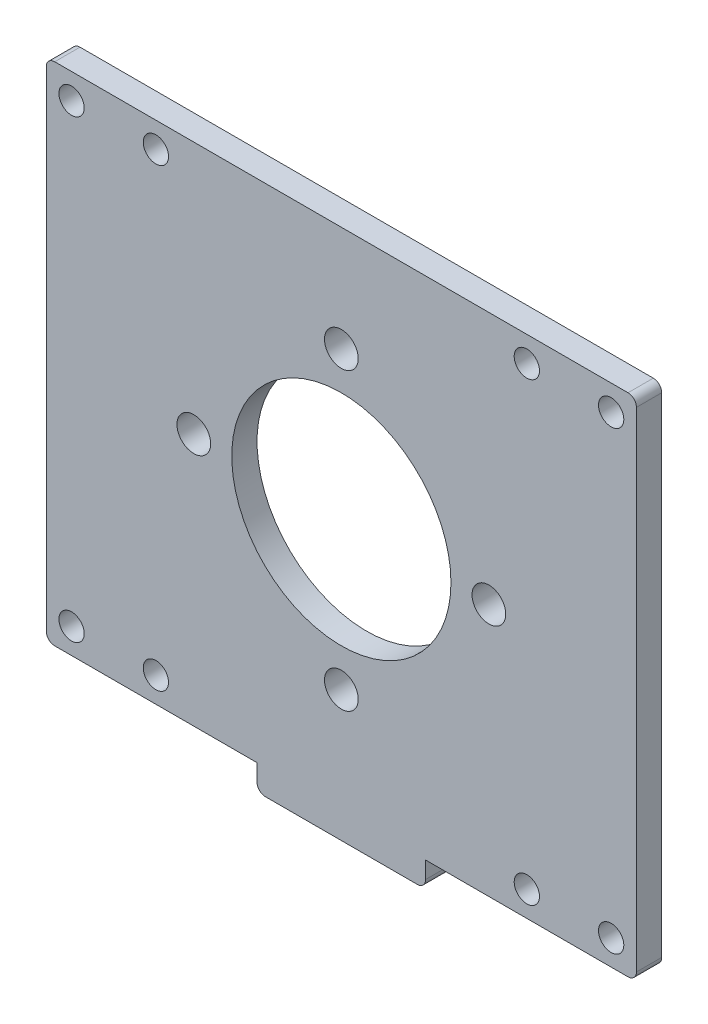
ISO-10303-21;
HEADER;
FILE_DESCRIPTION(('STEP AP214'),'2;1');
FILE_NAME('part.step','',(''),(''),'','','');
FILE_SCHEMA(('AUTOMOTIVE_DESIGN { 1 0 10303 214 1 1 1 1 }'));
ENDSEC;
DATA;
#1=APPLICATION_CONTEXT('core data for automotive mechanical design processes');
#2=APPLICATION_PROTOCOL_DEFINITION('international standard','automotive_design',2000,#1);
#3=PRODUCT_CONTEXT('',#1,'mechanical');
#4=PRODUCT('Part','Part','',(#3));
#5=PRODUCT_RELATED_PRODUCT_CATEGORY('part','',(#4));
#6=PRODUCT_DEFINITION_FORMATION('','',#4);
#7=PRODUCT_DEFINITION_CONTEXT('part definition',#1,'design');
#8=PRODUCT_DEFINITION('design','',#6,#7);
#9=PRODUCT_DEFINITION_SHAPE('','',#8);
#10=(LENGTH_UNIT() NAMED_UNIT(*) SI_UNIT(.MILLI.,.METRE.));
#11=(NAMED_UNIT(*) PLANE_ANGLE_UNIT() SI_UNIT($,.RADIAN.));
#12=(NAMED_UNIT(*) SI_UNIT($,.STERADIAN.) SOLID_ANGLE_UNIT());
#13=UNCERTAINTY_MEASURE_WITH_UNIT(LENGTH_MEASURE(1.E-05),#10,'distance_accuracy_value','');
#14=(GEOMETRIC_REPRESENTATION_CONTEXT(3) GLOBAL_UNCERTAINTY_ASSIGNED_CONTEXT((#13)) GLOBAL_UNIT_ASSIGNED_CONTEXT((#10,
#11,#12)) REPRESENTATION_CONTEXT('',''));
#15=CARTESIAN_POINT('',(0.,0.,0.));
#16=DIRECTION('',(0.,0.,1.));
#17=DIRECTION('',(1.,0.,0.));
#18=AXIS2_PLACEMENT_3D('',#15,#16,#17);
#19=CARTESIAN_POINT('',(-35.,-30.,3.));
#20=DIRECTION('',(0.,1.,0.));
#21=DIRECTION('',(0.,0.,1.));
#22=AXIS2_PLACEMENT_3D('',#19,#20,#21);
#23=PLANE('',#22);
#24=DIRECTION('',(1.,0.,0.));
#25=VECTOR('',#24,1.);
#26=CARTESIAN_POINT('',(-35.,-30.,0.));
#27=LINE('',#26,#25);
#28=CARTESIAN_POINT('',(10.,-30.,0.));
#29=VERTEX_POINT('',#28);
#30=CARTESIAN_POINT('',(34.,-30.,0.));
#31=VERTEX_POINT('',#30);
#32=EDGE_CURVE('E156',#29,#31,#27,.T.);
#33=ORIENTED_EDGE('',*,*,#32,.T.);
#34=DIRECTION('',(0.,0.,-1.));
#35=VECTOR('',#34,1.);
#36=CARTESIAN_POINT('',(34.,-30.,3.));
#37=LINE('',#36,#35);
#38=CARTESIAN_POINT('',(34.,-30.,3.));
#39=VERTEX_POINT('',#38);
#40=EDGE_CURVE('E61',#31,#39,#37,.F.);
#41=ORIENTED_EDGE('',*,*,#40,.T.);
#42=DIRECTION('',(1.,0.,0.));
#43=VECTOR('',#42,1.);
#44=CARTESIAN_POINT('',(-35.,-30.,3.));
#45=LINE('',#44,#43);
#46=CARTESIAN_POINT('',(10.,-30.,3.));
#47=VERTEX_POINT('',#46);
#48=EDGE_CURVE('E163',#47,#39,#45,.T.);
#49=ORIENTED_EDGE('',*,*,#48,.F.);
#50=DIRECTION('',(0.,0.,1.));
#51=VECTOR('',#50,1.);
#52=CARTESIAN_POINT('',(10.,-30.,0.));
#53=LINE('',#52,#51);
#54=EDGE_CURVE('E155',#29,#47,#53,.T.);
#55=ORIENTED_EDGE('',*,*,#54,.F.);
#56=EDGE_LOOP('',(#33,#41,#49,#55));
#57=FACE_BOUND('',#56,.T.);
#58=ADVANCED_FACE('F44',(#57),#23,.F.);
#59=CARTESIAN_POINT('',(35.,-30.,3.));
#60=DIRECTION('',(-1.,0.,0.));
#61=DIRECTION('',(0.,0.,1.));
#62=AXIS2_PLACEMENT_3D('',#59,#60,#61);
#63=PLANE('',#62);
#64=DIRECTION('',(0.,1.,0.));
#65=VECTOR('',#64,1.);
#66=CARTESIAN_POINT('',(35.,-30.,0.));
#67=LINE('',#66,#65);
#68=CARTESIAN_POINT('',(35.,-29.,0.));
#69=VERTEX_POINT('',#68);
#70=CARTESIAN_POINT('',(35.,29.,0.));
#71=VERTEX_POINT('',#70);
#72=EDGE_CURVE('E266',#69,#71,#67,.T.);
#73=ORIENTED_EDGE('',*,*,#72,.T.);
#74=DIRECTION('',(0.,0.,-1.));
#75=VECTOR('',#74,1.);
#76=CARTESIAN_POINT('',(35.,29.,3.));
#77=LINE('',#76,#75);
#78=CARTESIAN_POINT('',(35.,29.,3.));
#79=VERTEX_POINT('',#78);
#80=EDGE_CURVE('E238',#71,#79,#77,.F.);
#81=ORIENTED_EDGE('',*,*,#80,.T.);
#82=DIRECTION('',(0.,1.,0.));
#83=VECTOR('',#82,1.);
#84=CARTESIAN_POINT('',(35.,-30.,3.));
#85=LINE('',#84,#83);
#86=CARTESIAN_POINT('',(35.,-29.,3.));
#87=VERTEX_POINT('',#86);
#88=EDGE_CURVE('E174',#87,#79,#85,.T.);
#89=ORIENTED_EDGE('',*,*,#88,.F.);
#90=DIRECTION('',(0.,0.,-1.));
#91=VECTOR('',#90,1.);
#92=CARTESIAN_POINT('',(35.,-29.,3.));
#93=LINE('',#92,#91);
#94=EDGE_CURVE('E234',#87,#69,#93,.T.);
#95=ORIENTED_EDGE('',*,*,#94,.T.);
#96=EDGE_LOOP('',(#73,#81,#89,#95));
#97=FACE_BOUND('',#96,.T.);
#98=ADVANCED_FACE('F370',(#97),#63,.F.);
#99=CARTESIAN_POINT('',(-35.,30.,3.));
#100=DIRECTION('',(0.,-1.,0.));
#101=DIRECTION('',(0.,0.,-1.));
#102=AXIS2_PLACEMENT_3D('',#99,#100,#101);
#103=PLANE('',#102);
#104=DIRECTION('',(-1.,0.,0.));
#105=VECTOR('',#104,1.);
#106=CARTESIAN_POINT('',(-35.,30.,0.));
#107=LINE('',#106,#105);
#108=CARTESIAN_POINT('',(34.,30.,0.));
#109=VERTEX_POINT('',#108);
#110=CARTESIAN_POINT('',(-34.,30.,0.));
#111=VERTEX_POINT('',#110);
#112=EDGE_CURVE('E180',#109,#111,#107,.T.);
#113=ORIENTED_EDGE('',*,*,#112,.T.);
#114=DIRECTION('',(0.,0.,-1.));
#115=VECTOR('',#114,1.);
#116=CARTESIAN_POINT('',(-34.,30.,3.));
#117=LINE('',#116,#115);
#118=CARTESIAN_POINT('',(-34.,30.,3.));
#119=VERTEX_POINT('',#118);
#120=EDGE_CURVE('E233',#111,#119,#117,.F.);
#121=ORIENTED_EDGE('',*,*,#120,.T.);
#122=DIRECTION('',(-1.,0.,0.));
#123=VECTOR('',#122,1.);
#124=CARTESIAN_POINT('',(-35.,30.,3.));
#125=LINE('',#124,#123);
#126=CARTESIAN_POINT('',(34.,30.,3.));
#127=VERTEX_POINT('',#126);
#128=EDGE_CURVE('E260',#127,#119,#125,.T.);
#129=ORIENTED_EDGE('',*,*,#128,.F.);
#130=DIRECTION('',(0.,0.,-1.));
#131=VECTOR('',#130,1.);
#132=CARTESIAN_POINT('',(34.,30.,3.));
#133=LINE('',#132,#131);
#134=EDGE_CURVE('E227',#127,#109,#133,.T.);
#135=ORIENTED_EDGE('',*,*,#134,.T.);
#136=EDGE_LOOP('',(#113,#121,#129,#135));
#137=FACE_BOUND('',#136,.T.);
#138=ADVANCED_FACE('F278',(#137),#103,.F.);
#139=CARTESIAN_POINT('',(-35.,-30.,3.));
#140=DIRECTION('',(1.,0.,0.));
#141=DIRECTION('',(0.,0.,-1.));
#142=AXIS2_PLACEMENT_3D('',#139,#140,#141);
#143=PLANE('',#142);
#144=DIRECTION('',(0.,-1.,0.));
#145=VECTOR('',#144,1.);
#146=CARTESIAN_POINT('',(-35.,-30.,0.));
#147=LINE('',#146,#145);
#148=CARTESIAN_POINT('',(-35.,29.,0.));
#149=VERTEX_POINT('',#148);
#150=CARTESIAN_POINT('',(-35.,-29.,0.));
#151=VERTEX_POINT('',#150);
#152=EDGE_CURVE('E171',#149,#151,#147,.T.);
#153=ORIENTED_EDGE('',*,*,#152,.T.);
#154=DIRECTION('',(0.,0.,-1.));
#155=VECTOR('',#154,1.);
#156=CARTESIAN_POINT('',(-35.,-29.,3.));
#157=LINE('',#156,#155);
#158=CARTESIAN_POINT('',(-35.,-29.,3.));
#159=VERTEX_POINT('',#158);
#160=EDGE_CURVE('E210',#151,#159,#157,.F.);
#161=ORIENTED_EDGE('',*,*,#160,.T.);
#162=DIRECTION('',(0.,-1.,0.));
#163=VECTOR('',#162,1.);
#164=CARTESIAN_POINT('',(-35.,-30.,3.));
#165=LINE('',#164,#163);
#166=CARTESIAN_POINT('',(-35.,29.,3.));
#167=VERTEX_POINT('',#166);
#168=EDGE_CURVE('E251',#167,#159,#165,.T.);
#169=ORIENTED_EDGE('',*,*,#168,.F.);
#170=DIRECTION('',(0.,0.,-1.));
#171=VECTOR('',#170,1.);
#172=CARTESIAN_POINT('',(-35.,29.,3.));
#173=LINE('',#172,#171);
#174=EDGE_CURVE('E203',#167,#149,#173,.T.);
#175=ORIENTED_EDGE('',*,*,#174,.T.);
#176=EDGE_LOOP('',(#153,#161,#169,#175));
#177=FACE_BOUND('',#176,.T.);
#178=ADVANCED_FACE('F286',(#177),#143,.F.);
#179=CARTESIAN_POINT('',(-34.,-30.,3.));
#180=VERTEX_POINT('',#179);
#181=CARTESIAN_POINT('',(-10.,-30.,3.));
#182=VERTEX_POINT('',#181);
#183=EDGE_CURVE('E187',#180,#182,#45,.T.);
#184=ORIENTED_EDGE('',*,*,#183,.F.);
#185=DIRECTION('',(0.,0.,-1.));
#186=VECTOR('',#185,1.);
#187=CARTESIAN_POINT('',(-34.,-30.,3.));
#188=LINE('',#187,#186);
#189=CARTESIAN_POINT('',(-34.,-30.,0.));
#190=VERTEX_POINT('',#189);
#191=EDGE_CURVE('E181',#180,#190,#188,.T.);
#192=ORIENTED_EDGE('',*,*,#191,.T.);
#193=CARTESIAN_POINT('',(-10.,-30.,0.));
#194=VERTEX_POINT('',#193);
#195=EDGE_CURVE('E167',#190,#194,#27,.T.);
#196=ORIENTED_EDGE('',*,*,#195,.T.);
#197=DIRECTION('',(0.,0.,1.));
#198=VECTOR('',#197,1.);
#199=CARTESIAN_POINT('',(-10.,-30.,0.));
#200=LINE('',#199,#198);
#201=EDGE_CURVE('E161',#194,#182,#200,.T.);
#202=ORIENTED_EDGE('',*,*,#201,.T.);
#203=EDGE_LOOP('',(#184,#192,#196,#202));
#204=FACE_BOUND('',#203,.T.);
#205=ADVANCED_FACE('F301',(#204),#23,.F.);
#206=CARTESIAN_POINT('',(0.,0.,3.));
#207=DIRECTION('',(0.,0.,-1.));
#208=DIRECTION('',(-1.,0.,0.));
#209=AXIS2_PLACEMENT_3D('',#206,#207,#208);
#210=PLANE('',#209);
#211=CARTESIAN_POINT('',(-32.,-27.,3.));
#212=DIRECTION('',(0.,0.,1.));
#213=DIRECTION('',(1.,0.,0.));
#214=AXIS2_PLACEMENT_3D('',#211,#212,#213);
#215=CIRCLE('',#214,1.5);
#216=CARTESIAN_POINT('',(-30.5,-27.,3.));
#217=VERTEX_POINT('',#216);
#218=EDGE_CURVE('E660',#217,#217,#215,.T.);
#219=ORIENTED_EDGE('',*,*,#218,.F.);
#220=EDGE_LOOP('',(#219));
#221=FACE_BOUND('',#220,.T.);
#222=CARTESIAN_POINT('',(-22.,-27.,3.));
#223=DIRECTION('',(0.,0.,1.));
#224=DIRECTION('',(1.,0.,0.));
#225=AXIS2_PLACEMENT_3D('',#222,#223,#224);
#226=CIRCLE('',#225,1.5);
#227=CARTESIAN_POINT('',(-20.5,-27.,3.));
#228=VERTEX_POINT('',#227);
#229=EDGE_CURVE('E659',#228,#228,#226,.T.);
#230=ORIENTED_EDGE('',*,*,#229,.F.);
#231=EDGE_LOOP('',(#230));
#232=FACE_BOUND('',#231,.T.);
#233=CARTESIAN_POINT('',(22.,-27.,3.));
#234=DIRECTION('',(0.,0.,1.));
#235=DIRECTION('',(-1.,0.,0.));
#236=AXIS2_PLACEMENT_3D('',#233,#234,#235);
#237=CIRCLE('',#236,1.5);
#238=CARTESIAN_POINT('',(20.5,-27.,3.));
#239=VERTEX_POINT('',#238);
#240=EDGE_CURVE('E675',#239,#239,#237,.T.);
#241=ORIENTED_EDGE('',*,*,#240,.F.);
#242=EDGE_LOOP('',(#241));
#243=FACE_BOUND('',#242,.T.);
#244=CARTESIAN_POINT('',(32.,-27.,3.));
#245=DIRECTION('',(0.,0.,1.));
#246=DIRECTION('',(-1.,0.,0.));
#247=AXIS2_PLACEMENT_3D('',#244,#245,#246);
#248=CIRCLE('',#247,1.5);
#249=CARTESIAN_POINT('',(30.5,-27.,3.));
#250=VERTEX_POINT('',#249);
#251=EDGE_CURVE('E676',#250,#250,#248,.T.);
#252=ORIENTED_EDGE('',*,*,#251,.F.);
#253=EDGE_LOOP('',(#252));
#254=FACE_BOUND('',#253,.T.);
#255=CARTESIAN_POINT('',(-32.,27.,3.));
#256=DIRECTION('',(0.,0.,1.));
#257=DIRECTION('',(1.,0.,0.));
#258=AXIS2_PLACEMENT_3D('',#255,#256,#257);
#259=CIRCLE('',#258,1.5);
#260=CARTESIAN_POINT('',(-30.5,27.,3.));
#261=VERTEX_POINT('',#260);
#262=EDGE_CURVE('E691',#261,#261,#259,.T.);
#263=ORIENTED_EDGE('',*,*,#262,.F.);
#264=EDGE_LOOP('',(#263));
#265=FACE_BOUND('',#264,.T.);
#266=CARTESIAN_POINT('',(-22.,27.,3.));
#267=DIRECTION('',(0.,0.,1.));
#268=DIRECTION('',(1.,0.,0.));
#269=AXIS2_PLACEMENT_3D('',#266,#267,#268);
#270=CIRCLE('',#269,1.5);
#271=CARTESIAN_POINT('',(-20.5,27.,3.));
#272=VERTEX_POINT('',#271);
#273=EDGE_CURVE('E694',#272,#272,#270,.T.);
#274=ORIENTED_EDGE('',*,*,#273,.F.);
#275=EDGE_LOOP('',(#274));
#276=FACE_BOUND('',#275,.T.);
#277=CARTESIAN_POINT('',(22.,27.,3.));
#278=DIRECTION('',(0.,0.,1.));
#279=DIRECTION('',(-1.,0.,0.));
#280=AXIS2_PLACEMENT_3D('',#277,#278,#279);
#281=CIRCLE('',#280,1.5);
#282=CARTESIAN_POINT('',(20.5,27.,3.));
#283=VERTEX_POINT('',#282);
#284=EDGE_CURVE('E702',#283,#283,#281,.T.);
#285=ORIENTED_EDGE('',*,*,#284,.F.);
#286=EDGE_LOOP('',(#285));
#287=FACE_BOUND('',#286,.T.);
#288=CARTESIAN_POINT('',(32.,27.,3.));
#289=DIRECTION('',(0.,0.,1.));
#290=DIRECTION('',(-1.,0.,0.));
#291=AXIS2_PLACEMENT_3D('',#288,#289,#290);
#292=CIRCLE('',#291,1.5);
#293=CARTESIAN_POINT('',(30.5,27.,3.));
#294=VERTEX_POINT('',#293);
#295=EDGE_CURVE('E711',#294,#294,#292,.T.);
#296=ORIENTED_EDGE('',*,*,#295,.F.);
#297=EDGE_LOOP('',(#296));
#298=FACE_BOUND('',#297,.T.);
#299=CARTESIAN_POINT('',(0.,17.5,3.));
#300=DIRECTION('',(0.,0.,1.));
#301=DIRECTION('',(1.,0.,0.));
#302=AXIS2_PLACEMENT_3D('',#299,#300,#301);
#303=CIRCLE('',#302,2.);
#304=CARTESIAN_POINT('',(2.,17.5,3.));
#305=VERTEX_POINT('',#304);
#306=EDGE_CURVE('E321',#305,#305,#303,.T.);
#307=ORIENTED_EDGE('',*,*,#306,.F.);
#308=EDGE_LOOP('',(#307));
#309=FACE_BOUND('',#308,.T.);
#310=CARTESIAN_POINT('',(-17.5,0.,3.));
#311=DIRECTION('',(0.,0.,1.));
#312=DIRECTION('',(1.,0.,0.));
#313=AXIS2_PLACEMENT_3D('',#310,#311,#312);
#314=CIRCLE('',#313,2.);
#315=CARTESIAN_POINT('',(-15.5,0.,3.));
#316=VERTEX_POINT('',#315);
#317=EDGE_CURVE('E324',#316,#316,#314,.T.);
#318=ORIENTED_EDGE('',*,*,#317,.F.);
#319=EDGE_LOOP('',(#318));
#320=FACE_BOUND('',#319,.T.);
#321=CARTESIAN_POINT('',(0.,-17.5,3.));
#322=DIRECTION('',(0.,0.,1.));
#323=DIRECTION('',(-1.,0.,0.));
#324=AXIS2_PLACEMENT_3D('',#321,#322,#323);
#325=CIRCLE('',#324,2.);
#326=CARTESIAN_POINT('',(-2.,-17.5,3.));
#327=VERTEX_POINT('',#326);
#328=EDGE_CURVE('E333',#327,#327,#325,.T.);
#329=ORIENTED_EDGE('',*,*,#328,.F.);
#330=EDGE_LOOP('',(#329));
#331=FACE_BOUND('',#330,.T.);
#332=CARTESIAN_POINT('',(17.5,0.,3.));
#333=DIRECTION('',(0.,0.,1.));
#334=DIRECTION('',(-1.,0.,0.));
#335=AXIS2_PLACEMENT_3D('',#332,#333,#334);
#336=CIRCLE('',#335,2.);
#337=CARTESIAN_POINT('',(15.5,0.,3.));
#338=VERTEX_POINT('',#337);
#339=EDGE_CURVE('E311',#338,#338,#336,.T.);
#340=ORIENTED_EDGE('',*,*,#339,.F.);
#341=EDGE_LOOP('',(#340));
#342=FACE_BOUND('',#341,.T.);
#343=CARTESIAN_POINT('',(0.,0.,3.));
#344=DIRECTION('',(0.,0.,1.));
#345=DIRECTION('',(1.,0.,0.));
#346=AXIS2_PLACEMENT_3D('',#343,#344,#345);
#347=CIRCLE('',#346,13.);
#348=CARTESIAN_POINT('',(13.,0.,3.));
#349=VERTEX_POINT('',#348);
#350=EDGE_CURVE('E270',#349,#349,#347,.T.);
#351=ORIENTED_EDGE('',*,*,#350,.F.);
#352=EDGE_LOOP('',(#351));
#353=FACE_BOUND('',#352,.T.);
#354=ORIENTED_EDGE('',*,*,#168,.T.);
#355=CARTESIAN_POINT('',(-34.,-29.,3.));
#356=DIRECTION('',(0.,0.,-1.));
#357=DIRECTION('',(-1.,0.,0.));
#358=AXIS2_PLACEMENT_3D('',#355,#356,#357);
#359=CIRCLE('',#358,1.);
#360=EDGE_CURVE('E224',#159,#180,#359,.F.);
#361=ORIENTED_EDGE('',*,*,#360,.T.);
#362=ORIENTED_EDGE('',*,*,#183,.T.);
#363=DIRECTION('',(0.,-1.,0.));
#364=VECTOR('',#363,1.);
#365=CARTESIAN_POINT('',(-10.,-30.,3.));
#366=LINE('',#365,#364);
#367=CARTESIAN_POINT('',(-10.,-32.,3.));
#368=VERTEX_POINT('',#367);
#369=EDGE_CURVE('E414',#182,#368,#366,.T.);
#370=ORIENTED_EDGE('',*,*,#369,.T.);
#371=CARTESIAN_POINT('',(-9.00000000000001,-32.,3.));
#372=DIRECTION('',(0.,0.,-1.));
#373=DIRECTION('',(-1.,0.,0.));
#374=AXIS2_PLACEMENT_3D('',#371,#372,#373);
#375=CIRCLE('',#374,1.);
#376=CARTESIAN_POINT('',(-9.00000000000001,-33.,3.));
#377=VERTEX_POINT('',#376);
#378=EDGE_CURVE('E208',#368,#377,#375,.F.);
#379=ORIENTED_EDGE('',*,*,#378,.T.);
#380=DIRECTION('',(1.,0.,0.));
#381=VECTOR('',#380,1.);
#382=CARTESIAN_POINT('',(-10.,-33.,3.));
#383=LINE('',#382,#381);
#384=CARTESIAN_POINT('',(9.,-33.,3.));
#385=VERTEX_POINT('',#384);
#386=EDGE_CURVE('E413',#377,#385,#383,.T.);
#387=ORIENTED_EDGE('',*,*,#386,.T.);
#388=CARTESIAN_POINT('',(9.,-32.,3.));
#389=DIRECTION('',(0.,0.,-1.));
#390=DIRECTION('',(-1.,0.,0.));
#391=AXIS2_PLACEMENT_3D('',#388,#389,#390);
#392=CIRCLE('',#391,1.);
#393=CARTESIAN_POINT('',(10.,-32.,3.));
#394=VERTEX_POINT('',#393);
#395=EDGE_CURVE('E66',#385,#394,#392,.F.);
#396=ORIENTED_EDGE('',*,*,#395,.T.);
#397=DIRECTION('',(0.,1.,0.));
#398=VECTOR('',#397,1.);
#399=CARTESIAN_POINT('',(10.,-30.,3.));
#400=LINE('',#399,#398);
#401=EDGE_CURVE('E313',#394,#47,#400,.T.);
#402=ORIENTED_EDGE('',*,*,#401,.T.);
#403=ORIENTED_EDGE('',*,*,#48,.T.);
#404=CARTESIAN_POINT('',(34.,-29.,3.));
#405=DIRECTION('',(0.,0.,-1.));
#406=DIRECTION('',(-1.,0.,0.));
#407=AXIS2_PLACEMENT_3D('',#404,#405,#406);
#408=CIRCLE('',#407,1.);
#409=EDGE_CURVE('E214',#39,#87,#408,.F.);
#410=ORIENTED_EDGE('',*,*,#409,.T.);
#411=ORIENTED_EDGE('',*,*,#88,.T.);
#412=CARTESIAN_POINT('',(34.,29.,3.));
#413=DIRECTION('',(0.,0.,-1.));
#414=DIRECTION('',(-1.,0.,0.));
#415=AXIS2_PLACEMENT_3D('',#412,#413,#414);
#416=CIRCLE('',#415,1.);
#417=EDGE_CURVE('E219',#79,#127,#416,.F.);
#418=ORIENTED_EDGE('',*,*,#417,.T.);
#419=ORIENTED_EDGE('',*,*,#128,.T.);
#420=CARTESIAN_POINT('',(-34.,29.,3.));
#421=DIRECTION('',(0.,0.,-1.));
#422=DIRECTION('',(-1.,0.,0.));
#423=AXIS2_PLACEMENT_3D('',#420,#421,#422);
#424=CIRCLE('',#423,1.);
#425=EDGE_CURVE('E222',#119,#167,#424,.F.);
#426=ORIENTED_EDGE('',*,*,#425,.T.);
#427=EDGE_LOOP('',(#354,#361,#362,#370,#379,#387,#396,#402,#403,#410,#411,#418,#419,#426));
#428=FACE_BOUND('',#427,.T.);
#429=ADVANCED_FACE('F290',(#221,#232,#243,#254,#265,#276,#287,#298,#309,#320,#331,#342,#353,
#428),#210,.F.);
#430=CARTESIAN_POINT('',(0.,0.,0.));
#431=DIRECTION('',(0.,0.,-1.));
#432=DIRECTION('',(-1.,0.,0.));
#433=AXIS2_PLACEMENT_3D('',#430,#431,#432);
#434=PLANE('',#433);
#435=CARTESIAN_POINT('',(-32.,-27.,0.));
#436=DIRECTION('',(0.,0.,1.));
#437=DIRECTION('',(1.,0.,0.));
#438=AXIS2_PLACEMENT_3D('',#435,#436,#437);
#439=CIRCLE('',#438,1.5);
#440=CARTESIAN_POINT('',(-30.5,-27.,0.));
#441=VERTEX_POINT('',#440);
#442=EDGE_CURVE('E653',#441,#441,#439,.T.);
#443=ORIENTED_EDGE('',*,*,#442,.T.);
#444=EDGE_LOOP('',(#443));
#445=FACE_BOUND('',#444,.T.);
#446=CARTESIAN_POINT('',(-22.,-27.,0.));
#447=DIRECTION('',(0.,0.,1.));
#448=DIRECTION('',(1.,0.,0.));
#449=AXIS2_PLACEMENT_3D('',#446,#447,#448);
#450=CIRCLE('',#449,1.5);
#451=CARTESIAN_POINT('',(-20.5,-27.,0.));
#452=VERTEX_POINT('',#451);
#453=EDGE_CURVE('E666',#452,#452,#450,.T.);
#454=ORIENTED_EDGE('',*,*,#453,.T.);
#455=EDGE_LOOP('',(#454));
#456=FACE_BOUND('',#455,.T.);
#457=CARTESIAN_POINT('',(22.,-27.,0.));
#458=DIRECTION('',(0.,0.,1.));
#459=DIRECTION('',(-1.,0.,0.));
#460=AXIS2_PLACEMENT_3D('',#457,#458,#459);
#461=CIRCLE('',#460,1.5);
#462=CARTESIAN_POINT('',(20.5,-27.,0.));
#463=VERTEX_POINT('',#462);
#464=EDGE_CURVE('E677',#463,#463,#461,.T.);
#465=ORIENTED_EDGE('',*,*,#464,.T.);
#466=EDGE_LOOP('',(#465));
#467=FACE_BOUND('',#466,.T.);
#468=CARTESIAN_POINT('',(32.,-27.,0.));
#469=DIRECTION('',(0.,0.,1.));
#470=DIRECTION('',(-1.,0.,0.));
#471=AXIS2_PLACEMENT_3D('',#468,#469,#470);
#472=CIRCLE('',#471,1.5);
#473=CARTESIAN_POINT('',(30.5,-27.,0.));
#474=VERTEX_POINT('',#473);
#475=EDGE_CURVE('E685',#474,#474,#472,.T.);
#476=ORIENTED_EDGE('',*,*,#475,.T.);
#477=EDGE_LOOP('',(#476));
#478=FACE_BOUND('',#477,.T.);
#479=CARTESIAN_POINT('',(-32.,27.,0.));
#480=DIRECTION('',(0.,0.,1.));
#481=DIRECTION('',(1.,0.,0.));
#482=AXIS2_PLACEMENT_3D('',#479,#480,#481);
#483=CIRCLE('',#482,1.5);
#484=CARTESIAN_POINT('',(-30.5,27.,0.));
#485=VERTEX_POINT('',#484);
#486=EDGE_CURVE('E417',#485,#485,#483,.T.);
#487=ORIENTED_EDGE('',*,*,#486,.T.);
#488=EDGE_LOOP('',(#487));
#489=FACE_BOUND('',#488,.T.);
#490=CARTESIAN_POINT('',(-22.,27.,0.));
#491=DIRECTION('',(0.,0.,1.));
#492=DIRECTION('',(1.,0.,0.));
#493=AXIS2_PLACEMENT_3D('',#490,#491,#492);
#494=CIRCLE('',#493,1.5);
#495=CARTESIAN_POINT('',(-20.5,27.,0.));
#496=VERTEX_POINT('',#495);
#497=EDGE_CURVE('E697',#496,#496,#494,.T.);
#498=ORIENTED_EDGE('',*,*,#497,.T.);
#499=EDGE_LOOP('',(#498));
#500=FACE_BOUND('',#499,.T.);
#501=CARTESIAN_POINT('',(22.,27.,0.));
#502=DIRECTION('',(0.,0.,1.));
#503=DIRECTION('',(-1.,0.,0.));
#504=AXIS2_PLACEMENT_3D('',#501,#502,#503);
#505=CIRCLE('',#504,1.5);
#506=CARTESIAN_POINT('',(20.5,27.,0.));
#507=VERTEX_POINT('',#506);
#508=EDGE_CURVE('E710',#507,#507,#505,.T.);
#509=ORIENTED_EDGE('',*,*,#508,.T.);
#510=EDGE_LOOP('',(#509));
#511=FACE_BOUND('',#510,.T.);
#512=CARTESIAN_POINT('',(32.,27.,0.));
#513=DIRECTION('',(0.,0.,1.));
#514=DIRECTION('',(-1.,0.,0.));
#515=AXIS2_PLACEMENT_3D('',#512,#513,#514);
#516=CIRCLE('',#515,1.5);
#517=CARTESIAN_POINT('',(30.5,27.,0.));
#518=VERTEX_POINT('',#517);
#519=EDGE_CURVE('E661',#518,#518,#516,.T.);
#520=ORIENTED_EDGE('',*,*,#519,.T.);
#521=EDGE_LOOP('',(#520));
#522=FACE_BOUND('',#521,.T.);
#523=CARTESIAN_POINT('',(0.,17.5,0.));
#524=DIRECTION('',(0.,0.,1.));
#525=DIRECTION('',(1.,0.,0.));
#526=AXIS2_PLACEMENT_3D('',#523,#524,#525);
#527=CIRCLE('',#526,2.);
#528=CARTESIAN_POINT('',(2.,17.5,0.));
#529=VERTEX_POINT('',#528);
#530=EDGE_CURVE('E320',#529,#529,#527,.T.);
#531=ORIENTED_EDGE('',*,*,#530,.T.);
#532=EDGE_LOOP('',(#531));
#533=FACE_BOUND('',#532,.T.);
#534=CARTESIAN_POINT('',(-17.5,0.,0.));
#535=DIRECTION('',(0.,0.,1.));
#536=DIRECTION('',(1.,0.,0.));
#537=AXIS2_PLACEMENT_3D('',#534,#535,#536);
#538=CIRCLE('',#537,2.);
#539=CARTESIAN_POINT('',(-15.5,0.,0.));
#540=VERTEX_POINT('',#539);
#541=EDGE_CURVE('E326',#540,#540,#538,.T.);
#542=ORIENTED_EDGE('',*,*,#541,.T.);
#543=EDGE_LOOP('',(#542));
#544=FACE_BOUND('',#543,.T.);
#545=CARTESIAN_POINT('',(0.,-17.5,0.));
#546=DIRECTION('',(0.,0.,1.));
#547=DIRECTION('',(-1.,0.,0.));
#548=AXIS2_PLACEMENT_3D('',#545,#546,#547);
#549=CIRCLE('',#548,2.);
#550=CARTESIAN_POINT('',(-2.,-17.5,0.));
#551=VERTEX_POINT('',#550);
#552=EDGE_CURVE('E340',#551,#551,#549,.T.);
#553=ORIENTED_EDGE('',*,*,#552,.T.);
#554=EDGE_LOOP('',(#553));
#555=FACE_BOUND('',#554,.T.);
#556=CARTESIAN_POINT('',(17.5,0.,0.));
#557=DIRECTION('',(0.,0.,1.));
#558=DIRECTION('',(-1.,0.,0.));
#559=AXIS2_PLACEMENT_3D('',#556,#557,#558);
#560=CIRCLE('',#559,2.);
#561=CARTESIAN_POINT('',(15.5,0.,0.));
#562=VERTEX_POINT('',#561);
#563=EDGE_CURVE('E310',#562,#562,#560,.T.);
#564=ORIENTED_EDGE('',*,*,#563,.T.);
#565=EDGE_LOOP('',(#564));
#566=FACE_BOUND('',#565,.T.);
#567=CARTESIAN_POINT('',(0.,0.,0.));
#568=DIRECTION('',(0.,0.,1.));
#569=DIRECTION('',(1.,0.,0.));
#570=AXIS2_PLACEMENT_3D('',#567,#568,#569);
#571=CIRCLE('',#570,13.);
#572=CARTESIAN_POINT('',(13.,0.,0.));
#573=VERTEX_POINT('',#572);
#574=EDGE_CURVE('E271',#573,#573,#571,.T.);
#575=ORIENTED_EDGE('',*,*,#574,.T.);
#576=EDGE_LOOP('',(#575));
#577=FACE_BOUND('',#576,.T.);
#578=ORIENTED_EDGE('',*,*,#195,.F.);
#579=CARTESIAN_POINT('',(-34.,-29.,0.));
#580=DIRECTION('',(0.,0.,-1.));
#581=DIRECTION('',(-1.,0.,0.));
#582=AXIS2_PLACEMENT_3D('',#579,#580,#581);
#583=CIRCLE('',#582,1.);
#584=EDGE_CURVE('E198',#190,#151,#583,.T.);
#585=ORIENTED_EDGE('',*,*,#584,.T.);
#586=ORIENTED_EDGE('',*,*,#152,.F.);
#587=CARTESIAN_POINT('',(-34.,29.,0.));
#588=DIRECTION('',(0.,0.,-1.));
#589=DIRECTION('',(-1.,0.,0.));
#590=AXIS2_PLACEMENT_3D('',#587,#588,#589);
#591=CIRCLE('',#590,1.);
#592=EDGE_CURVE('E200',#149,#111,#591,.T.);
#593=ORIENTED_EDGE('',*,*,#592,.T.);
#594=ORIENTED_EDGE('',*,*,#112,.F.);
#595=CARTESIAN_POINT('',(34.,29.,0.));
#596=DIRECTION('',(0.,0.,-1.));
#597=DIRECTION('',(-1.,0.,0.));
#598=AXIS2_PLACEMENT_3D('',#595,#596,#597);
#599=CIRCLE('',#598,1.);
#600=EDGE_CURVE('E193',#109,#71,#599,.T.);
#601=ORIENTED_EDGE('',*,*,#600,.T.);
#602=ORIENTED_EDGE('',*,*,#72,.F.);
#603=CARTESIAN_POINT('',(34.,-29.,0.));
#604=DIRECTION('',(0.,0.,-1.));
#605=DIRECTION('',(-1.,0.,0.));
#606=AXIS2_PLACEMENT_3D('',#603,#604,#605);
#607=CIRCLE('',#606,1.);
#608=EDGE_CURVE('E166',#69,#31,#607,.T.);
#609=ORIENTED_EDGE('',*,*,#608,.T.);
#610=ORIENTED_EDGE('',*,*,#32,.F.);
#611=DIRECTION('',(0.,1.,0.));
#612=VECTOR('',#611,1.);
#613=CARTESIAN_POINT('',(10.,-30.,0.));
#614=LINE('',#613,#612);
#615=CARTESIAN_POINT('',(10.,-32.,0.));
#616=VERTEX_POINT('',#615);
#617=EDGE_CURVE('E148',#616,#29,#614,.T.);
#618=ORIENTED_EDGE('',*,*,#617,.F.);
#619=CARTESIAN_POINT('',(9.,-32.,0.));
#620=DIRECTION('',(0.,0.,-1.));
#621=DIRECTION('',(-1.,0.,0.));
#622=AXIS2_PLACEMENT_3D('',#619,#620,#621);
#623=CIRCLE('',#622,1.);
#624=CARTESIAN_POINT('',(9.,-33.,0.));
#625=VERTEX_POINT('',#624);
#626=EDGE_CURVE('E186',#616,#625,#623,.T.);
#627=ORIENTED_EDGE('',*,*,#626,.T.);
#628=DIRECTION('',(1.,0.,0.));
#629=VECTOR('',#628,1.);
#630=CARTESIAN_POINT('',(-10.,-33.,0.));
#631=LINE('',#630,#629);
#632=CARTESIAN_POINT('',(-9.00000000000001,-33.,0.));
#633=VERTEX_POINT('',#632);
#634=EDGE_CURVE('E158',#633,#625,#631,.T.);
#635=ORIENTED_EDGE('',*,*,#634,.F.);
#636=CARTESIAN_POINT('',(-9.00000000000001,-32.,0.));
#637=DIRECTION('',(0.,0.,-1.));
#638=DIRECTION('',(-1.,0.,0.));
#639=AXIS2_PLACEMENT_3D('',#636,#637,#638);
#640=CIRCLE('',#639,1.);
#641=CARTESIAN_POINT('',(-10.,-32.,0.));
#642=VERTEX_POINT('',#641);
#643=EDGE_CURVE('E184',#633,#642,#640,.T.);
#644=ORIENTED_EDGE('',*,*,#643,.T.);
#645=DIRECTION('',(0.,-1.,0.));
#646=VECTOR('',#645,1.);
#647=CARTESIAN_POINT('',(-10.,-30.,0.));
#648=LINE('',#647,#646);
#649=EDGE_CURVE('E410',#194,#642,#648,.T.);
#650=ORIENTED_EDGE('',*,*,#649,.F.);
#651=EDGE_LOOP('',(#578,#585,#586,#593,#594,#601,#602,#609,#610,#618,#627,#635,#644,#650));
#652=FACE_BOUND('',#651,.T.);
#653=ADVANCED_FACE('F168',(#445,#456,#467,#478,#489,#500,#511,#522,#533,#544,#555,#566,#577,
#652),#434,.T.);
#654=CARTESIAN_POINT('',(0.,0.,0.));
#655=DIRECTION('',(0.,0.,1.));
#656=DIRECTION('',(1.,0.,0.));
#657=AXIS2_PLACEMENT_3D('',#654,#655,#656);
#658=CYLINDRICAL_SURFACE('',#657,13.);
#659=ORIENTED_EDGE('',*,*,#574,.F.);
#660=EDGE_LOOP('',(#659));
#661=FACE_BOUND('',#660,.T.);
#662=ORIENTED_EDGE('',*,*,#350,.T.);
#663=EDGE_LOOP('',(#662));
#664=FACE_BOUND('',#663,.T.);
#665=ADVANCED_FACE('F352',(#661,#664),#658,.F.);
#666=CARTESIAN_POINT('',(17.5,0.,0.));
#667=DIRECTION('',(0.,0.,1.));
#668=DIRECTION('',(1.,0.,0.));
#669=AXIS2_PLACEMENT_3D('',#666,#667,#668);
#670=CYLINDRICAL_SURFACE('',#669,2.);
#671=ORIENTED_EDGE('',*,*,#563,.F.);
#672=EDGE_LOOP('',(#671));
#673=FACE_BOUND('',#672,.T.);
#674=ORIENTED_EDGE('',*,*,#339,.T.);
#675=EDGE_LOOP('',(#674));
#676=FACE_BOUND('',#675,.T.);
#677=ADVANCED_FACE('F442',(#673,#676),#670,.F.);
#678=CARTESIAN_POINT('',(0.,-17.5,0.));
#679=DIRECTION('',(0.,0.,1.));
#680=DIRECTION('',(1.,0.,0.));
#681=AXIS2_PLACEMENT_3D('',#678,#679,#680);
#682=CYLINDRICAL_SURFACE('',#681,2.);
#683=ORIENTED_EDGE('',*,*,#552,.F.);
#684=EDGE_LOOP('',(#683));
#685=FACE_BOUND('',#684,.T.);
#686=ORIENTED_EDGE('',*,*,#328,.T.);
#687=EDGE_LOOP('',(#686));
#688=FACE_BOUND('',#687,.T.);
#689=ADVANCED_FACE('F437',(#685,#688),#682,.F.);
#690=CARTESIAN_POINT('',(-17.5,0.,0.));
#691=DIRECTION('',(0.,0.,1.));
#692=DIRECTION('',(1.,0.,0.));
#693=AXIS2_PLACEMENT_3D('',#690,#691,#692);
#694=CYLINDRICAL_SURFACE('',#693,2.);
#695=ORIENTED_EDGE('',*,*,#541,.F.);
#696=EDGE_LOOP('',(#695));
#697=FACE_BOUND('',#696,.T.);
#698=ORIENTED_EDGE('',*,*,#317,.T.);
#699=EDGE_LOOP('',(#698));
#700=FACE_BOUND('',#699,.T.);
#701=ADVANCED_FACE('F435',(#697,#700),#694,.F.);
#702=CARTESIAN_POINT('',(0.,17.5,0.));
#703=DIRECTION('',(0.,0.,1.));
#704=DIRECTION('',(1.,0.,0.));
#705=AXIS2_PLACEMENT_3D('',#702,#703,#704);
#706=CYLINDRICAL_SURFACE('',#705,2.);
#707=ORIENTED_EDGE('',*,*,#530,.F.);
#708=EDGE_LOOP('',(#707));
#709=FACE_BOUND('',#708,.T.);
#710=ORIENTED_EDGE('',*,*,#306,.T.);
#711=EDGE_LOOP('',(#710));
#712=FACE_BOUND('',#711,.T.);
#713=ADVANCED_FACE('F424',(#709,#712),#706,.F.);
#714=CARTESIAN_POINT('',(-10.,-30.,0.));
#715=DIRECTION('',(-1.,0.,0.));
#716=DIRECTION('',(0.,-1.,0.));
#717=AXIS2_PLACEMENT_3D('',#714,#715,#716);
#718=PLANE('',#717);
#719=ORIENTED_EDGE('',*,*,#649,.T.);
#720=DIRECTION('',(0.,0.,1.));
#721=VECTOR('',#720,1.);
#722=CARTESIAN_POINT('',(-10.,-32.,0.));
#723=LINE('',#722,#721);
#724=EDGE_CURVE('E11',#642,#368,#723,.T.);
#725=ORIENTED_EDGE('',*,*,#724,.T.);
#726=ORIENTED_EDGE('',*,*,#369,.F.);
#727=ORIENTED_EDGE('',*,*,#201,.F.);
#728=EDGE_LOOP('',(#719,#725,#726,#727));
#729=FACE_BOUND('',#728,.T.);
#730=ADVANCED_FACE('F421',(#729),#718,.T.);
#731=CARTESIAN_POINT('',(10.,-30.,0.));
#732=DIRECTION('',(1.,0.,0.));
#733=DIRECTION('',(0.,1.,0.));
#734=AXIS2_PLACEMENT_3D('',#731,#732,#733);
#735=PLANE('',#734);
#736=ORIENTED_EDGE('',*,*,#401,.F.);
#737=DIRECTION('',(0.,0.,1.));
#738=VECTOR('',#737,1.);
#739=CARTESIAN_POINT('',(10.,-32.,0.));
#740=LINE('',#739,#738);
#741=EDGE_CURVE('E53',#394,#616,#740,.F.);
#742=ORIENTED_EDGE('',*,*,#741,.T.);
#743=ORIENTED_EDGE('',*,*,#617,.T.);
#744=ORIENTED_EDGE('',*,*,#54,.T.);
#745=EDGE_LOOP('',(#736,#742,#743,#744));
#746=FACE_BOUND('',#745,.T.);
#747=ADVANCED_FACE('F152',(#746),#735,.T.);
#748=CARTESIAN_POINT('',(-10.,-33.,0.));
#749=DIRECTION('',(0.,-1.,0.));
#750=DIRECTION('',(0.,0.,-1.));
#751=AXIS2_PLACEMENT_3D('',#748,#749,#750);
#752=PLANE('',#751);
#753=ORIENTED_EDGE('',*,*,#634,.T.);
#754=DIRECTION('',(0.,0.,1.));
#755=VECTOR('',#754,1.);
#756=CARTESIAN_POINT('',(9.,-33.,0.));
#757=LINE('',#756,#755);
#758=EDGE_CURVE('E246',#625,#385,#757,.T.);
#759=ORIENTED_EDGE('',*,*,#758,.T.);
#760=ORIENTED_EDGE('',*,*,#386,.F.);
#761=DIRECTION('',(0.,0.,1.));
#762=VECTOR('',#761,1.);
#763=CARTESIAN_POINT('',(-9.00000000000001,-33.,0.));
#764=LINE('',#763,#762);
#765=EDGE_CURVE('E243',#377,#633,#764,.F.);
#766=ORIENTED_EDGE('',*,*,#765,.T.);
#767=EDGE_LOOP('',(#753,#759,#760,#766));
#768=FACE_BOUND('',#767,.T.);
#769=ADVANCED_FACE('F401',(#768),#752,.T.);
#770=CARTESIAN_POINT('',(32.,27.,0.));
#771=DIRECTION('',(0.,0.,1.));
#772=DIRECTION('',(1.,0.,0.));
#773=AXIS2_PLACEMENT_3D('',#770,#771,#772);
#774=CYLINDRICAL_SURFACE('',#773,1.5);
#775=ORIENTED_EDGE('',*,*,#519,.F.);
#776=EDGE_LOOP('',(#775));
#777=FACE_BOUND('',#776,.T.);
#778=ORIENTED_EDGE('',*,*,#295,.T.);
#779=EDGE_LOOP('',(#778));
#780=FACE_BOUND('',#779,.T.);
#781=ADVANCED_FACE('F477',(#777,#780),#774,.F.);
#782=CARTESIAN_POINT('',(22.,27.,0.));
#783=DIRECTION('',(0.,0.,1.));
#784=DIRECTION('',(1.,0.,0.));
#785=AXIS2_PLACEMENT_3D('',#782,#783,#784);
#786=CYLINDRICAL_SURFACE('',#785,1.5);
#787=ORIENTED_EDGE('',*,*,#508,.F.);
#788=EDGE_LOOP('',(#787));
#789=FACE_BOUND('',#788,.T.);
#790=ORIENTED_EDGE('',*,*,#284,.T.);
#791=EDGE_LOOP('',(#790));
#792=FACE_BOUND('',#791,.T.);
#793=ADVANCED_FACE('F478',(#789,#792),#786,.F.);
#794=CARTESIAN_POINT('',(-22.,27.,0.));
#795=DIRECTION('',(0.,0.,1.));
#796=DIRECTION('',(1.,0.,0.));
#797=AXIS2_PLACEMENT_3D('',#794,#795,#796);
#798=CYLINDRICAL_SURFACE('',#797,1.5);
#799=ORIENTED_EDGE('',*,*,#497,.F.);
#800=EDGE_LOOP('',(#799));
#801=FACE_BOUND('',#800,.T.);
#802=ORIENTED_EDGE('',*,*,#273,.T.);
#803=EDGE_LOOP('',(#802));
#804=FACE_BOUND('',#803,.T.);
#805=ADVANCED_FACE('F489',(#801,#804),#798,.F.);
#806=CARTESIAN_POINT('',(-32.,27.,0.));
#807=DIRECTION('',(0.,0.,1.));
#808=DIRECTION('',(1.,0.,0.));
#809=AXIS2_PLACEMENT_3D('',#806,#807,#808);
#810=CYLINDRICAL_SURFACE('',#809,1.5);
#811=ORIENTED_EDGE('',*,*,#486,.F.);
#812=EDGE_LOOP('',(#811));
#813=FACE_BOUND('',#812,.T.);
#814=ORIENTED_EDGE('',*,*,#262,.T.);
#815=EDGE_LOOP('',(#814));
#816=FACE_BOUND('',#815,.T.);
#817=ADVANCED_FACE('F497',(#813,#816),#810,.F.);
#818=CARTESIAN_POINT('',(32.,-27.,0.));
#819=DIRECTION('',(0.,0.,1.));
#820=DIRECTION('',(1.,0.,0.));
#821=AXIS2_PLACEMENT_3D('',#818,#819,#820);
#822=CYLINDRICAL_SURFACE('',#821,1.5);
#823=ORIENTED_EDGE('',*,*,#475,.F.);
#824=EDGE_LOOP('',(#823));
#825=FACE_BOUND('',#824,.T.);
#826=ORIENTED_EDGE('',*,*,#251,.T.);
#827=EDGE_LOOP('',(#826));
#828=FACE_BOUND('',#827,.T.);
#829=ADVANCED_FACE('F507',(#825,#828),#822,.F.);
#830=CARTESIAN_POINT('',(22.,-27.,0.));
#831=DIRECTION('',(0.,0.,1.));
#832=DIRECTION('',(1.,0.,0.));
#833=AXIS2_PLACEMENT_3D('',#830,#831,#832);
#834=CYLINDRICAL_SURFACE('',#833,1.5);
#835=ORIENTED_EDGE('',*,*,#464,.F.);
#836=EDGE_LOOP('',(#835));
#837=FACE_BOUND('',#836,.T.);
#838=ORIENTED_EDGE('',*,*,#240,.T.);
#839=EDGE_LOOP('',(#838));
#840=FACE_BOUND('',#839,.T.);
#841=ADVANCED_FACE('F520',(#837,#840),#834,.F.);
#842=CARTESIAN_POINT('',(-22.,-27.,0.));
#843=DIRECTION('',(0.,0.,1.));
#844=DIRECTION('',(1.,0.,0.));
#845=AXIS2_PLACEMENT_3D('',#842,#843,#844);
#846=CYLINDRICAL_SURFACE('',#845,1.5);
#847=ORIENTED_EDGE('',*,*,#453,.F.);
#848=EDGE_LOOP('',(#847));
#849=FACE_BOUND('',#848,.T.);
#850=ORIENTED_EDGE('',*,*,#229,.T.);
#851=EDGE_LOOP('',(#850));
#852=FACE_BOUND('',#851,.T.);
#853=ADVANCED_FACE('F527',(#849,#852),#846,.F.);
#854=CARTESIAN_POINT('',(-32.,-27.,0.));
#855=DIRECTION('',(0.,0.,1.));
#856=DIRECTION('',(1.,0.,0.));
#857=AXIS2_PLACEMENT_3D('',#854,#855,#856);
#858=CYLINDRICAL_SURFACE('',#857,1.5);
#859=ORIENTED_EDGE('',*,*,#442,.F.);
#860=EDGE_LOOP('',(#859));
#861=FACE_BOUND('',#860,.T.);
#862=ORIENTED_EDGE('',*,*,#218,.T.);
#863=EDGE_LOOP('',(#862));
#864=FACE_BOUND('',#863,.T.);
#865=ADVANCED_FACE('F382',(#861,#864),#858,.F.);
#866=CARTESIAN_POINT('',(-34.,-29.,3.));
#867=DIRECTION('',(0.,0.,-1.));
#868=DIRECTION('',(-1.,0.,0.));
#869=AXIS2_PLACEMENT_3D('',#866,#867,#868);
#870=CYLINDRICAL_SURFACE('',#869,1.);
#871=ORIENTED_EDGE('',*,*,#360,.F.);
#872=ORIENTED_EDGE('',*,*,#160,.F.);
#873=ORIENTED_EDGE('',*,*,#584,.F.);
#874=ORIENTED_EDGE('',*,*,#191,.F.);
#875=EDGE_LOOP('',(#871,#872,#873,#874));
#876=FACE_BOUND('',#875,.T.);
#877=ADVANCED_FACE('F295',(#876),#870,.T.);
#878=CARTESIAN_POINT('',(-34.,29.,3.));
#879=DIRECTION('',(0.,0.,-1.));
#880=DIRECTION('',(-1.,0.,0.));
#881=AXIS2_PLACEMENT_3D('',#878,#879,#880);
#882=CYLINDRICAL_SURFACE('',#881,1.);
#883=ORIENTED_EDGE('',*,*,#425,.F.);
#884=ORIENTED_EDGE('',*,*,#120,.F.);
#885=ORIENTED_EDGE('',*,*,#592,.F.);
#886=ORIENTED_EDGE('',*,*,#174,.F.);
#887=EDGE_LOOP('',(#883,#884,#885,#886));
#888=FACE_BOUND('',#887,.T.);
#889=ADVANCED_FACE('F281',(#888),#882,.T.);
#890=CARTESIAN_POINT('',(34.,29.,3.));
#891=DIRECTION('',(0.,0.,-1.));
#892=DIRECTION('',(-1.,0.,0.));
#893=AXIS2_PLACEMENT_3D('',#890,#891,#892);
#894=CYLINDRICAL_SURFACE('',#893,1.);
#895=ORIENTED_EDGE('',*,*,#417,.F.);
#896=ORIENTED_EDGE('',*,*,#80,.F.);
#897=ORIENTED_EDGE('',*,*,#600,.F.);
#898=ORIENTED_EDGE('',*,*,#134,.F.);
#899=EDGE_LOOP('',(#895,#896,#897,#898));
#900=FACE_BOUND('',#899,.T.);
#901=ADVANCED_FACE('F381',(#900),#894,.T.);
#902=CARTESIAN_POINT('',(34.,-29.,3.));
#903=DIRECTION('',(0.,0.,-1.));
#904=DIRECTION('',(-1.,0.,0.));
#905=AXIS2_PLACEMENT_3D('',#902,#903,#904);
#906=CYLINDRICAL_SURFACE('',#905,1.);
#907=ORIENTED_EDGE('',*,*,#409,.F.);
#908=ORIENTED_EDGE('',*,*,#40,.F.);
#909=ORIENTED_EDGE('',*,*,#608,.F.);
#910=ORIENTED_EDGE('',*,*,#94,.F.);
#911=EDGE_LOOP('',(#907,#908,#909,#910));
#912=FACE_BOUND('',#911,.T.);
#913=ADVANCED_FACE('F390',(#912),#906,.T.);
#914=CARTESIAN_POINT('',(9.,-32.,0.));
#915=DIRECTION('',(0.,0.,1.));
#916=DIRECTION('',(1.,0.,0.));
#917=AXIS2_PLACEMENT_3D('',#914,#915,#916);
#918=CYLINDRICAL_SURFACE('',#917,1.);
#919=ORIENTED_EDGE('',*,*,#626,.F.);
#920=ORIENTED_EDGE('',*,*,#741,.F.);
#921=ORIENTED_EDGE('',*,*,#395,.F.);
#922=ORIENTED_EDGE('',*,*,#758,.F.);
#923=EDGE_LOOP('',(#919,#920,#921,#922));
#924=FACE_BOUND('',#923,.T.);
#925=ADVANCED_FACE('F389',(#924),#918,.T.);
#926=CARTESIAN_POINT('',(-9.00000000000001,-32.,0.));
#927=DIRECTION('',(0.,0.,1.));
#928=DIRECTION('',(1.,0.,0.));
#929=AXIS2_PLACEMENT_3D('',#926,#927,#928);
#930=CYLINDRICAL_SURFACE('',#929,1.);
#931=ORIENTED_EDGE('',*,*,#643,.F.);
#932=ORIENTED_EDGE('',*,*,#765,.F.);
#933=ORIENTED_EDGE('',*,*,#378,.F.);
#934=ORIENTED_EDGE('',*,*,#724,.F.);
#935=EDGE_LOOP('',(#931,#932,#933,#934));
#936=FACE_BOUND('',#935,.T.);
#937=ADVANCED_FACE('F50',(#936),#930,.T.);
#938=CLOSED_SHELL('',(#58,#98,#138,#178,#205,#429,#653,#665,#677,#689,#701,#713,#730,#747,#769,
#781,#793,#805,#817,#829,#841,#853,#865,#877,#889,#901,#913,#925,#937));
#939=MANIFOLD_SOLID_BREP('B2',#938);
#940=ADVANCED_BREP_SHAPE_REPRESENTATION('',(#18,#939),#14);
#941=SHAPE_DEFINITION_REPRESENTATION(#9,#940);
ENDSEC;
END-ISO-10303-21;
